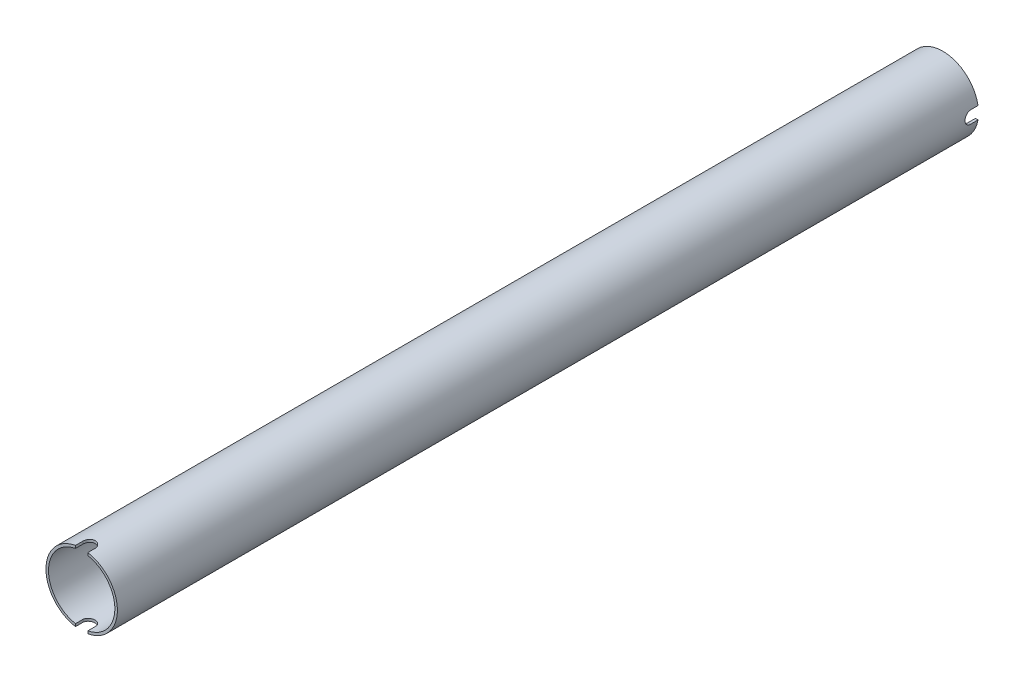
ISO-10303-21;
HEADER;
FILE_DESCRIPTION(('STEP AP214'),'2;1');
FILE_NAME('part.step','',(''),(''),'','','');
FILE_SCHEMA(('AUTOMOTIVE_DESIGN { 1 0 10303 214 1 1 1 1 }'));
ENDSEC;
DATA;
#1=APPLICATION_CONTEXT('core data for automotive mechanical design processes');
#2=APPLICATION_PROTOCOL_DEFINITION('international standard','automotive_design',2000,#1);
#3=PRODUCT_CONTEXT('',#1,'mechanical');
#4=PRODUCT('Part','Part','',(#3));
#5=PRODUCT_RELATED_PRODUCT_CATEGORY('part','',(#4));
#6=PRODUCT_DEFINITION_FORMATION('','',#4);
#7=PRODUCT_DEFINITION_CONTEXT('part definition',#1,'design');
#8=PRODUCT_DEFINITION('design','',#6,#7);
#9=PRODUCT_DEFINITION_SHAPE('','',#8);
#10=(LENGTH_UNIT() NAMED_UNIT(*) SI_UNIT(.MILLI.,.METRE.));
#11=(NAMED_UNIT(*) PLANE_ANGLE_UNIT() SI_UNIT($,.RADIAN.));
#12=(NAMED_UNIT(*) SI_UNIT($,.STERADIAN.) SOLID_ANGLE_UNIT());
#13=UNCERTAINTY_MEASURE_WITH_UNIT(LENGTH_MEASURE(1.E-05),#10,'distance_accuracy_value','');
#14=(GEOMETRIC_REPRESENTATION_CONTEXT(3) GLOBAL_UNCERTAINTY_ASSIGNED_CONTEXT((#13)) GLOBAL_UNIT_ASSIGNED_CONTEXT((#10,
#11,#12)) REPRESENTATION_CONTEXT('',''));
#15=CARTESIAN_POINT('',(0.,0.,0.));
#16=DIRECTION('',(0.,0.,1.));
#17=DIRECTION('',(1.,0.,0.));
#18=AXIS2_PLACEMENT_3D('',#15,#16,#17);
#19=CARTESIAN_POINT('',(0.,6.93419999999999,-90.01125));
#20=DIRECTION('',(0.,0.,1.));
#21=DIRECTION('',(1.,0.,0.));
#22=AXIS2_PLACEMENT_3D('',#19,#20,#21);
#23=PLANE('',#22);
#24=CARTESIAN_POINT('',(0.,0.,-90.01125));
#25=DIRECTION('',(0.,0.,1.));
#26=DIRECTION('',(1.,0.,0.));
#27=AXIS2_PLACEMENT_3D('',#24,#25,#26);
#28=CIRCLE('',#27,7.46760000000001);
#29=CARTESIAN_POINT('',(-7.35438567114888,-1.29540000000001,-90.01125));
#30=VERTEX_POINT('',#29);
#31=CARTESIAN_POINT('',(7.35438567114888,-1.29540000000001,-90.01125));
#32=VERTEX_POINT('',#31);
#33=EDGE_CURVE('E292',#30,#32,#28,.T.);
#34=ORIENTED_EDGE('',*,*,#33,.F.);
#35=DIRECTION('',(1.,0.,0.));
#36=VECTOR('',#35,1.);
#37=CARTESIAN_POINT('',(0.,-1.2954,-90.01125));
#38=LINE('',#37,#36);
#39=CARTESIAN_POINT('',(-6.8121265754535,-1.2954,-90.01125));
#40=VERTEX_POINT('',#39);
#41=EDGE_CURVE('E171',#30,#40,#38,.T.);
#42=ORIENTED_EDGE('',*,*,#41,.T.);
#43=CARTESIAN_POINT('',(0.,0.,-90.01125));
#44=DIRECTION('',(0.,0.,1.));
#45=DIRECTION('',(1.,0.,0.));
#46=AXIS2_PLACEMENT_3D('',#43,#44,#45);
#47=CIRCLE('',#46,6.93419999999999);
#48=CARTESIAN_POINT('',(6.8121265754535,-1.2954,-90.01125));
#49=VERTEX_POINT('',#48);
#50=EDGE_CURVE('E291',#40,#49,#47,.T.);
#51=ORIENTED_EDGE('',*,*,#50,.T.);
#52=EDGE_CURVE('E175',#49,#32,#38,.T.);
#53=ORIENTED_EDGE('',*,*,#52,.T.);
#54=EDGE_LOOP('',(#34,#42,#51,#53));
#55=FACE_BOUND('',#54,.T.);
#56=ADVANCED_FACE('F35',(#55),#23,.F.);
#57=CARTESIAN_POINT('',(0.,7.46759999999999,90.01125));
#58=DIRECTION('',(0.,0.,-1.));
#59=DIRECTION('',(-1.,0.,0.));
#60=AXIS2_PLACEMENT_3D('',#57,#58,#59);
#61=PLANE('',#60);
#62=CARTESIAN_POINT('',(0.,0.,90.01125));
#63=DIRECTION('',(0.,0.,1.));
#64=DIRECTION('',(1.,0.,0.));
#65=AXIS2_PLACEMENT_3D('',#62,#63,#64);
#66=CIRCLE('',#65,7.46759999999999);
#67=CARTESIAN_POINT('',(-1.2954,7.35438567114888,90.01125));
#68=VERTEX_POINT('',#67);
#69=CARTESIAN_POINT('',(-1.2954,-7.35438567114888,90.01125));
#70=VERTEX_POINT('',#69);
#71=EDGE_CURVE('E287',#68,#70,#66,.T.);
#72=ORIENTED_EDGE('',*,*,#71,.T.);
#73=DIRECTION('',(0.,1.,0.));
#74=VECTOR('',#73,1.);
#75=CARTESIAN_POINT('',(-1.2954,7.46759999999999,90.01125));
#76=LINE('',#75,#74);
#77=CARTESIAN_POINT('',(-1.2954,-6.8121265754535,90.01125));
#78=VERTEX_POINT('',#77);
#79=EDGE_CURVE('E278',#70,#78,#76,.T.);
#80=ORIENTED_EDGE('',*,*,#79,.T.);
#81=CARTESIAN_POINT('',(0.,0.,90.01125));
#82=DIRECTION('',(0.,0.,1.));
#83=DIRECTION('',(1.,0.,0.));
#84=AXIS2_PLACEMENT_3D('',#81,#82,#83);
#85=CIRCLE('',#84,6.93419999999999);
#86=CARTESIAN_POINT('',(-1.2954,6.8121265754535,90.01125));
#87=VERTEX_POINT('',#86);
#88=EDGE_CURVE('E297',#87,#78,#85,.T.);
#89=ORIENTED_EDGE('',*,*,#88,.F.);
#90=EDGE_CURVE('E274',#87,#68,#76,.T.);
#91=ORIENTED_EDGE('',*,*,#90,.T.);
#92=EDGE_LOOP('',(#72,#80,#89,#91));
#93=FACE_BOUND('',#92,.T.);
#94=ADVANCED_FACE('F308',(#93),#61,.F.);
#95=CARTESIAN_POINT('',(1.2954,-7.35438567114888,90.01125));
#96=VERTEX_POINT('',#95);
#97=CARTESIAN_POINT('',(1.2954,7.35438567114887,90.01125));
#98=VERTEX_POINT('',#97);
#99=EDGE_CURVE('E284',#96,#98,#66,.T.);
#100=ORIENTED_EDGE('',*,*,#99,.T.);
#101=DIRECTION('',(0.,-1.,0.));
#102=VECTOR('',#101,1.);
#103=CARTESIAN_POINT('',(1.2954,7.46759999999999,90.01125));
#104=LINE('',#103,#102);
#105=CARTESIAN_POINT('',(1.2954,6.8121265754535,90.01125));
#106=VERTEX_POINT('',#105);
#107=EDGE_CURVE('E325',#98,#106,#104,.T.);
#108=ORIENTED_EDGE('',*,*,#107,.T.);
#109=CARTESIAN_POINT('',(1.2954,-6.8121265754535,90.01125));
#110=VERTEX_POINT('',#109);
#111=EDGE_CURVE('E295',#110,#106,#85,.T.);
#112=ORIENTED_EDGE('',*,*,#111,.F.);
#113=EDGE_CURVE('E326',#110,#96,#104,.T.);
#114=ORIENTED_EDGE('',*,*,#113,.T.);
#115=EDGE_LOOP('',(#100,#108,#112,#114));
#116=FACE_BOUND('',#115,.T.);
#117=ADVANCED_FACE('F37',(#116),#61,.F.);
#118=CARTESIAN_POINT('',(0.,0.,54.4055316213805));
#119=DIRECTION('',(0.,0.,1.));
#120=DIRECTION('',(1.,0.,0.));
#121=AXIS2_PLACEMENT_3D('',#118,#119,#120);
#122=CYLINDRICAL_SURFACE('',#121,6.93419999999999);
#123=ORIENTED_EDGE('',*,*,#50,.F.);
#124=DIRECTION('',(0.,0.,1.));
#125=VECTOR('',#124,1.);
#126=CARTESIAN_POINT('',(-6.8121265754535,-1.29540000000001,54.4055316213805));
#127=LINE('',#126,#125);
#128=CARTESIAN_POINT('',(-6.8121265754535,-1.2954,-88.48725));
#129=VERTEX_POINT('',#128);
#130=EDGE_CURVE('E170',#40,#129,#127,.T.);
#131=ORIENTED_EDGE('',*,*,#130,.T.);
#132=CARTESIAN_POINT('',(-6.8121265754535,-1.2954,-88.48725));
#133=CARTESIAN_POINT('',(-6.81212486116484,-1.29540013699187,-88.4511445060641));
#134=CARTESIAN_POINT('',(-6.8124139893911,-1.29388954142777,-88.4150566280327));
#135=CARTESIAN_POINT('',(-6.81355602064963,-1.28786564610855,-88.3431454492232));
#136=CARTESIAN_POINT('',(-6.81440885952316,-1.28335268806711,-88.3073221188048));
#137=CARTESIAN_POINT('',(-6.81778099544098,-1.26536556579438,-88.2007445379712));
#138=CARTESIAN_POINT('',(-6.8211140744424,-1.24744295102498,-88.1307142203505));
#139=CARTESIAN_POINT('',(-6.82957011411668,-1.20027838562022,-87.994724591757));
#140=CARTESIAN_POINT('',(-6.83469335423679,-1.17103466766407,-87.9287659182675));
#141=CARTESIAN_POINT('',(-6.84614988720786,-1.10207922355403,-87.8026741969064));
#142=CARTESIAN_POINT('',(-6.85248325983094,-1.06236680723642,-87.7425415334803));
#143=CARTESIAN_POINT('',(-6.86573270424985,-0.973086320479177,-87.6290935799136));
#144=CARTESIAN_POINT('',(-6.87265439859156,-0.923415064372355,-87.575860175299));
#145=CARTESIAN_POINT('',(-6.88625165814546,-0.815844168823147,-87.4784257845944));
#146=CARTESIAN_POINT('',(-6.89292718528299,-0.757943263168412,-87.434226191001));
#147=CARTESIAN_POINT('',(-6.90534000409008,-0.635018062879804,-87.3558050695975));
#148=CARTESIAN_POINT('',(-6.91106983685105,-0.569943318979293,-87.3216613414624));
#149=CARTESIAN_POINT('',(-6.92088190288254,-0.434859961785096,-87.2648237910541));
#150=CARTESIAN_POINT('',(-6.92496436183804,-0.36485202586771,-87.2421284002883));
#151=CARTESIAN_POINT('',(-6.93098209625569,-0.222742255083513,-87.2090843952839));
#152=CARTESIAN_POINT('',(-6.93294156947332,-0.150673839911472,-87.1985965351363));
#153=CARTESIAN_POINT('',(-6.93457596989165,-0.00577377332465954,-87.1898313884485));
#154=CARTESIAN_POINT('',(-6.93425103676473,0.0670578311555857,-87.1915533553793));
#155=CARTESIAN_POINT('',(-6.93137206725993,0.210458344468027,-87.2070525853211));
#156=CARTESIAN_POINT('',(-6.92884581316386,0.281044130674403,-87.2206796034082));
#157=CARTESIAN_POINT('',(-6.92187923974746,0.418908774429751,-87.2593644297178));
#158=CARTESIAN_POINT('',(-6.91743886429478,0.486187534934476,-87.2844225731636));
#159=CARTESIAN_POINT('',(-6.90709643047967,0.615966096611637,-87.3454021445107));
#160=CARTESIAN_POINT('',(-6.90118629164061,0.678436891291547,-87.3813838780852));
#161=CARTESIAN_POINT('',(-6.88855832349516,0.796507857730594,-87.4631436743354));
#162=CARTESIAN_POINT('',(-6.88184044031279,0.852107570691326,-87.5089223906219));
#163=CARTESIAN_POINT('',(-6.86822108278513,0.955744038715096,-87.6097978887219));
#164=CARTESIAN_POINT('',(-6.86131836807592,1.00365385935701,-87.6650249838001));
#165=CARTESIAN_POINT('',(-6.84820244964764,1.08956316526959,-87.7828162044977));
#166=CARTESIAN_POINT('',(-6.84198943919024,1.12755987680003,-87.8453823765461));
#167=CARTESIAN_POINT('',(-6.83095363004522,1.19260098204662,-87.976252379713));
#168=CARTESIAN_POINT('',(-6.82613397134459,1.21962069318979,-88.0445687290047));
#169=CARTESIAN_POINT('',(-6.81847816267161,1.26172536242156,-88.1848363543268));
#170=CARTESIAN_POINT('',(-6.81563905550343,1.27682811836275,-88.25678203834));
#171=CARTESIAN_POINT('',(-6.81334722712931,1.2889666311106,-88.3556178942459));
#172=CARTESIAN_POINT('',(-6.81288994558935,1.2913800544401,-88.3819074607618));
#173=CARTESIAN_POINT('',(-6.81227989656846,1.29459468331232,-88.4345441157636));
#174=CARTESIAN_POINT('',(-6.8121266178893,1.29539859536211,-88.4608910329769));
#175=CARTESIAN_POINT('',(-6.8121265754535,1.2954,-88.48725));
#176=B_SPLINE_CURVE_WITH_KNOTS('',3,(#132,#133,#134,#135,#136,#137,#138,#139,#140,#141,#142,
#143,#144,#145,#146,#147,#148,#149,#150,#151,#152,#153,#154,#155,#156,#157,#158,#159,#160,#161,
#162,#163,#164,#165,#166,#167,#168,#169,#170,#171,#172,#173,#174,#175),.UNSPECIFIED.,.F.,.F.,(4,
2,2,2,2,2,2,2,2,2,2,2,2,2,2,2,2,2,2,2,2,4),(0.,0.108248930900297,0.216485543563386,
0.432459859435146,0.648467904344803,0.864490193452774,1.08287859669174,1.3013006375766,
1.52137065259745,1.7414105084796,1.95891507798372,2.1764063490148,2.39119183879021,
2.60598362766027,2.82198346918565,3.0379977257483,3.25727511731999,3.47661379821961,
3.6964429838779,3.91594323214535,3.99511664346655,4.07415680689762),.UNSPECIFIED.);
#177=CARTESIAN_POINT('',(-6.81212657545351,1.2954,-88.48725));
#178=VERTEX_POINT('',#177);
#179=EDGE_CURVE('E159',#129,#178,#176,.T.);
#180=ORIENTED_EDGE('',*,*,#179,.T.);
#181=DIRECTION('',(0.,0.,1.));
#182=VECTOR('',#181,1.);
#183=CARTESIAN_POINT('',(-6.81212657545351,1.29539999999996,54.4055316213805));
#184=LINE('',#183,#182);
#185=CARTESIAN_POINT('',(-6.8121265754535,1.2954,-90.01125));
#186=VERTEX_POINT('',#185);
#187=EDGE_CURVE('E146',#178,#186,#184,.F.);
#188=ORIENTED_EDGE('',*,*,#187,.T.);
#189=CARTESIAN_POINT('',(6.8121265754535,1.2954,-90.01125));
#190=VERTEX_POINT('',#189);
#191=EDGE_CURVE('E293',#190,#186,#47,.T.);
#192=ORIENTED_EDGE('',*,*,#191,.F.);
#193=DIRECTION('',(0.,0.,1.));
#194=VECTOR('',#193,1.);
#195=CARTESIAN_POINT('',(6.81212657545351,1.29539999999996,54.4055316213805));
#196=LINE('',#195,#194);
#197=CARTESIAN_POINT('',(6.8121265754535,1.2954,-88.48725));
#198=VERTEX_POINT('',#197);
#199=EDGE_CURVE('E356',#190,#198,#196,.T.);
#200=ORIENTED_EDGE('',*,*,#199,.T.);
#201=CARTESIAN_POINT('',(6.8121265754535,1.2954,-88.48725));
#202=CARTESIAN_POINT('',(6.81212486116484,1.29540013699187,-88.4511445060641));
#203=CARTESIAN_POINT('',(6.8124139893911,1.29388954142777,-88.4150566280327));
#204=CARTESIAN_POINT('',(6.81355602064963,1.28786564610855,-88.3431454492232));
#205=CARTESIAN_POINT('',(6.81440885952316,1.28335268806711,-88.3073221188048));
#206=CARTESIAN_POINT('',(6.81778099544098,1.26536556579438,-88.2007445379712));
#207=CARTESIAN_POINT('',(6.8211140744424,1.24744295102498,-88.1307142203505));
#208=CARTESIAN_POINT('',(6.82957011411668,1.20027838562022,-87.994724591757));
#209=CARTESIAN_POINT('',(6.83469335423679,1.17103466766407,-87.9287659182675));
#210=CARTESIAN_POINT('',(6.84614988720786,1.10207922355403,-87.8026741969064));
#211=CARTESIAN_POINT('',(6.85248325983094,1.06236680723642,-87.7425415334803));
#212=CARTESIAN_POINT('',(6.86573270424985,0.973086320479177,-87.6290935799136));
#213=CARTESIAN_POINT('',(6.87265439859156,0.923415064372355,-87.575860175299));
#214=CARTESIAN_POINT('',(6.88625165814546,0.815844168823148,-87.4784257845944));
#215=CARTESIAN_POINT('',(6.89292718528299,0.757943263168412,-87.434226191001));
#216=CARTESIAN_POINT('',(6.90534000409008,0.635018062879804,-87.3558050695975));
#217=CARTESIAN_POINT('',(6.91106983685105,0.569943318979293,-87.3216613414624));
#218=CARTESIAN_POINT('',(6.92088190288254,0.434859961785096,-87.2648237910541));
#219=CARTESIAN_POINT('',(6.92496436183804,0.36485202586771,-87.2421284002883));
#220=CARTESIAN_POINT('',(6.93098209625569,0.222742255083513,-87.2090843952839));
#221=CARTESIAN_POINT('',(6.93294156947332,0.150673839911473,-87.1985965351363));
#222=CARTESIAN_POINT('',(6.93457596989165,0.00577377332465965,-87.1898313884485));
#223=CARTESIAN_POINT('',(6.93425103676473,-0.0670578311555856,-87.1915533553793));
#224=CARTESIAN_POINT('',(6.93137206725993,-0.210458344468027,-87.2070525853211));
#225=CARTESIAN_POINT('',(6.92884581316386,-0.281044130674402,-87.2206796034082));
#226=CARTESIAN_POINT('',(6.92187923974746,-0.418908774429751,-87.2593644297178));
#227=CARTESIAN_POINT('',(6.91743886429478,-0.486187534934477,-87.2844225731636));
#228=CARTESIAN_POINT('',(6.90709643047967,-0.615966096611635,-87.3454021445107));
#229=CARTESIAN_POINT('',(6.90118629164062,-0.678436891291542,-87.3813838780852));
#230=CARTESIAN_POINT('',(6.88855832349516,-0.79650785773059,-87.4631436743354));
#231=CARTESIAN_POINT('',(6.88184044031279,-0.852107570691325,-87.5089223906219));
#232=CARTESIAN_POINT('',(6.86822108278513,-0.955744038715099,-87.6097978887219));
#233=CARTESIAN_POINT('',(6.86131836807592,-1.00365385935701,-87.6650249838001));
#234=CARTESIAN_POINT('',(6.84820244964764,-1.0895631652696,-87.7828162044977));
#235=CARTESIAN_POINT('',(6.84198943919024,-1.12755987680003,-87.8453823765461));
#236=CARTESIAN_POINT('',(6.83095363004522,-1.19260098204662,-87.976252379713));
#237=CARTESIAN_POINT('',(6.82613397134459,-1.21962069318979,-88.0445687290047));
#238=CARTESIAN_POINT('',(6.81847816267161,-1.26172536242156,-88.1848363543268));
#239=CARTESIAN_POINT('',(6.81563905550343,-1.27682811836275,-88.25678203834));
#240=CARTESIAN_POINT('',(6.81334722712931,-1.2889666311106,-88.3556178942459));
#241=CARTESIAN_POINT('',(6.81288994558935,-1.2913800544401,-88.3819074607618));
#242=CARTESIAN_POINT('',(6.81227989656846,-1.29459468331232,-88.4345441157636));
#243=CARTESIAN_POINT('',(6.8121266178893,-1.29539859536211,-88.4608910329769));
#244=CARTESIAN_POINT('',(6.8121265754535,-1.2954,-88.48725));
#245=B_SPLINE_CURVE_WITH_KNOTS('',3,(#201,#202,#203,#204,#205,#206,#207,#208,#209,#210,#211,
#212,#213,#214,#215,#216,#217,#218,#219,#220,#221,#222,#223,#224,#225,#226,#227,#228,#229,#230,
#231,#232,#233,#234,#235,#236,#237,#238,#239,#240,#241,#242,#243,#244),.UNSPECIFIED.,.F.,.F.,(4,
2,2,2,2,2,2,2,2,2,2,2,2,2,2,2,2,2,2,2,2,4),(0.,0.108248930900297,0.216485543563386,
0.432459859435146,0.648467904344803,0.864490193452774,1.08287859669174,1.3013006375766,
1.52137065259745,1.7414105084796,1.95891507798372,2.1764063490148,2.39119183879021,
2.60598362766027,2.82198346918564,3.0379977257483,3.25727511732001,3.4766137982196,
3.6964429838779,3.91594323214535,3.99511664346655,4.07415680689762),.UNSPECIFIED.);
#246=CARTESIAN_POINT('',(6.8121265754535,-1.2954,-88.48725));
#247=VERTEX_POINT('',#246);
#248=EDGE_CURVE('E154',#198,#247,#245,.T.);
#249=ORIENTED_EDGE('',*,*,#248,.T.);
#250=DIRECTION('',(0.,0.,1.));
#251=VECTOR('',#250,1.);
#252=CARTESIAN_POINT('',(6.8121265754535,-1.29540000000001,54.4055316213805));
#253=LINE('',#252,#251);
#254=EDGE_CURVE('E339',#247,#49,#253,.F.);
#255=ORIENTED_EDGE('',*,*,#254,.T.);
#256=EDGE_LOOP('',(#123,#131,#180,#188,#192,#200,#249,#255));
#257=FACE_BOUND('',#256,.T.);
#258=CARTESIAN_POINT('',(1.2954,6.8121265754535,88.48725));
#259=CARTESIAN_POINT('',(1.29540013699187,6.81212486116484,88.4511445060641));
#260=CARTESIAN_POINT('',(1.29388954142777,6.81241398939109,88.4150566280327));
#261=CARTESIAN_POINT('',(1.28786564610855,6.81355602064963,88.3431454492232));
#262=CARTESIAN_POINT('',(1.28335268806712,6.81440885952316,88.3073221188048));
#263=CARTESIAN_POINT('',(1.26536556579438,6.81778099544098,88.2007445379712));
#264=CARTESIAN_POINT('',(1.24744295102498,6.8211140744424,88.1307142203505));
#265=CARTESIAN_POINT('',(1.20027838562022,6.82957011411668,87.994724591757));
#266=CARTESIAN_POINT('',(1.17103466766407,6.83469335423679,87.9287659182675));
#267=CARTESIAN_POINT('',(1.10207922355403,6.84614988720786,87.8026741969064));
#268=CARTESIAN_POINT('',(1.06236680723642,6.85248325983094,87.7425415334803));
#269=CARTESIAN_POINT('',(0.973086320479178,6.86573270424985,87.6290935799136));
#270=CARTESIAN_POINT('',(0.923415064372356,6.87265439859156,87.575860175299));
#271=CARTESIAN_POINT('',(0.815844168823149,6.88625165814546,87.4784257845944));
#272=CARTESIAN_POINT('',(0.757943263168414,6.89292718528299,87.434226191001));
#273=CARTESIAN_POINT('',(0.635018062879806,6.90534000409008,87.3558050695975));
#274=CARTESIAN_POINT('',(0.569943318979295,6.91106983685105,87.3216613414624));
#275=CARTESIAN_POINT('',(0.434859961785098,6.92088190288254,87.2648237910541));
#276=CARTESIAN_POINT('',(0.364852025867711,6.92496436183804,87.2421284002883));
#277=CARTESIAN_POINT('',(0.222742255083513,6.93098209625569,87.2090843952839));
#278=CARTESIAN_POINT('',(0.150673839911473,6.93294156947332,87.1985965351364));
#279=CARTESIAN_POINT('',(0.00577377332465877,6.93457596989165,87.1898313884485));
#280=CARTESIAN_POINT('',(-0.0670578311555871,6.93425103676473,87.1915533553792));
#281=CARTESIAN_POINT('',(-0.210458344468027,6.93137206725993,87.2070525853211));
#282=CARTESIAN_POINT('',(-0.2810441306744,6.92884581316386,87.2206796034082));
#283=CARTESIAN_POINT('',(-0.418908774429748,6.92187923974746,87.2593644297178));
#284=CARTESIAN_POINT('',(-0.486187534934475,6.91743886429478,87.2844225731636));
#285=CARTESIAN_POINT('',(-0.61596609661164,6.90709643047967,87.3454021445107));
#286=CARTESIAN_POINT('',(-0.678436891291553,6.90118629164061,87.3813838780852));
#287=CARTESIAN_POINT('',(-0.7965078577306,6.88855832349516,87.4631436743354));
#288=CARTESIAN_POINT('',(-0.852107570691329,6.88184044031279,87.5089223906219));
#289=CARTESIAN_POINT('',(-0.955744038715099,6.86822108278513,87.6097978887219));
#290=CARTESIAN_POINT('',(-1.00365385935701,6.86131836807592,87.6650249838001));
#291=CARTESIAN_POINT('',(-1.0895631652696,6.84820244964764,87.7828162044977));
#292=CARTESIAN_POINT('',(-1.12755987680003,6.84198943919024,87.8453823765461));
#293=CARTESIAN_POINT('',(-1.19260098204662,6.83095363004522,87.976252379713));
#294=CARTESIAN_POINT('',(-1.21962069318979,6.82613397134459,88.0445687290047));
#295=CARTESIAN_POINT('',(-1.26172536242156,6.81847816267161,88.1848363543268));
#296=CARTESIAN_POINT('',(-1.27682811836275,6.81563905550343,88.25678203834));
#297=CARTESIAN_POINT('',(-1.2889666311106,6.81334722712931,88.3556178942459));
#298=CARTESIAN_POINT('',(-1.2913800544401,6.81288994558935,88.3819074607618));
#299=CARTESIAN_POINT('',(-1.29459468331232,6.81227989656846,88.4345441157636));
#300=CARTESIAN_POINT('',(-1.29539859536211,6.8121266178893,88.4608910329769));
#301=CARTESIAN_POINT('',(-1.2954,6.8121265754535,88.48725));
#302=B_SPLINE_CURVE_WITH_KNOTS('',3,(#258,#259,#260,#261,#262,#263,#264,#265,#266,#267,#268,
#269,#270,#271,#272,#273,#274,#275,#276,#277,#278,#279,#280,#281,#282,#283,#284,#285,#286,#287,
#288,#289,#290,#291,#292,#293,#294,#295,#296,#297,#298,#299,#300,#301),.UNSPECIFIED.,.F.,.F.,(4,
2,2,2,2,2,2,2,2,2,2,2,2,2,2,2,2,2,2,2,2,4),(0.,0.108248930900297,0.216485543563386,
0.432459859435146,0.648467904344803,0.864490193452774,1.08287859669174,1.3013006375766,
1.52137065259745,1.7414105084796,1.95891507798372,2.1764063490148,2.39119183879022,
2.60598362766028,2.82198346918566,3.03799772574831,3.25727511732001,3.47661379821961,
3.69644298387791,3.91594323214536,3.99511664346656,4.07415680689763),.UNSPECIFIED.);
#303=CARTESIAN_POINT('',(1.2954,6.81212657545349,88.48725));
#304=VERTEX_POINT('',#303);
#305=CARTESIAN_POINT('',(-1.2954,6.8121265754535,88.48725));
#306=VERTEX_POINT('',#305);
#307=EDGE_CURVE('E258',#304,#306,#302,.T.);
#308=ORIENTED_EDGE('',*,*,#307,.T.);
#309=DIRECTION('',(0.,0.,1.));
#310=VECTOR('',#309,1.);
#311=CARTESIAN_POINT('',(-1.2954,6.8121265754535,54.4055316213805));
#312=LINE('',#311,#310);
#313=EDGE_CURVE('E277',#306,#87,#312,.T.);
#314=ORIENTED_EDGE('',*,*,#313,.T.);
#315=ORIENTED_EDGE('',*,*,#88,.T.);
#316=DIRECTION('',(0.,0.,1.));
#317=VECTOR('',#316,1.);
#318=CARTESIAN_POINT('',(-1.2954,-6.8121265754535,54.4055316213805));
#319=LINE('',#318,#317);
#320=CARTESIAN_POINT('',(-1.2954,-6.8121265754535,88.48725));
#321=VERTEX_POINT('',#320);
#322=EDGE_CURVE('E281',#78,#321,#319,.F.);
#323=ORIENTED_EDGE('',*,*,#322,.T.);
#324=CARTESIAN_POINT('',(-1.2954,-6.8121265754535,88.48725));
#325=CARTESIAN_POINT('',(-1.29540013699187,-6.81212486116484,88.4511445060641));
#326=CARTESIAN_POINT('',(-1.29388954142777,-6.81241398939109,88.4150566280327));
#327=CARTESIAN_POINT('',(-1.28786564610855,-6.81355602064963,88.3431454492232));
#328=CARTESIAN_POINT('',(-1.28335268806712,-6.81440885952316,88.3073221188048));
#329=CARTESIAN_POINT('',(-1.26536556579438,-6.81778099544098,88.2007445379712));
#330=CARTESIAN_POINT('',(-1.24744295102498,-6.8211140744424,88.1307142203505));
#331=CARTESIAN_POINT('',(-1.20027838562022,-6.82957011411668,87.994724591757));
#332=CARTESIAN_POINT('',(-1.17103466766407,-6.83469335423679,87.9287659182675));
#333=CARTESIAN_POINT('',(-1.10207922355403,-6.84614988720786,87.8026741969064));
#334=CARTESIAN_POINT('',(-1.06236680723642,-6.85248325983094,87.7425415334803));
#335=CARTESIAN_POINT('',(-0.973086320479178,-6.86573270424985,87.6290935799136));
#336=CARTESIAN_POINT('',(-0.923415064372356,-6.87265439859156,87.575860175299));
#337=CARTESIAN_POINT('',(-0.815844168823149,-6.88625165814546,87.4784257845944));
#338=CARTESIAN_POINT('',(-0.757943263168414,-6.89292718528299,87.434226191001));
#339=CARTESIAN_POINT('',(-0.635018062879806,-6.90534000409008,87.3558050695975));
#340=CARTESIAN_POINT('',(-0.569943318979295,-6.91106983685105,87.3216613414624));
#341=CARTESIAN_POINT('',(-0.434859961785098,-6.92088190288254,87.2648237910541));
#342=CARTESIAN_POINT('',(-0.364852025867712,-6.92496436183804,87.2421284002883));
#343=CARTESIAN_POINT('',(-0.222742255083514,-6.93098209625569,87.2090843952839));
#344=CARTESIAN_POINT('',(-0.150673839911473,-6.93294156947332,87.1985965351364));
#345=CARTESIAN_POINT('',(-0.00577377332465936,-6.93457596989165,87.1898313884485));
#346=CARTESIAN_POINT('',(0.0670578311555865,-6.93425103676473,87.1915533553792));
#347=CARTESIAN_POINT('',(0.210458344468026,-6.93137206725993,87.2070525853211));
#348=CARTESIAN_POINT('',(0.281044130674399,-6.92884581316386,87.2206796034082));
#349=CARTESIAN_POINT('',(0.418908774429747,-6.92187923974746,87.2593644297178));
#350=CARTESIAN_POINT('',(0.486187534934475,-6.91743886429478,87.2844225731636));
#351=CARTESIAN_POINT('',(0.615966096611637,-6.90709643047967,87.3454021445107));
#352=CARTESIAN_POINT('',(0.678436891291546,-6.90118629164061,87.3813838780852));
#353=CARTESIAN_POINT('',(0.796507857730591,-6.88855832349516,87.4631436743354));
#354=CARTESIAN_POINT('',(0.852107570691322,-6.88184044031279,87.5089223906219));
#355=CARTESIAN_POINT('',(0.955744038715095,-6.86822108278513,87.6097978887219));
#356=CARTESIAN_POINT('',(1.00365385935701,-6.86131836807592,87.6650249838001));
#357=CARTESIAN_POINT('',(1.0895631652696,-6.84820244964764,87.7828162044977));
#358=CARTESIAN_POINT('',(1.12755987680003,-6.84198943919024,87.8453823765461));
#359=CARTESIAN_POINT('',(1.19260098204663,-6.83095363004522,87.976252379713));
#360=CARTESIAN_POINT('',(1.21962069318979,-6.82613397134459,88.0445687290047));
#361=CARTESIAN_POINT('',(1.26172536242156,-6.81847816267161,88.1848363543268));
#362=CARTESIAN_POINT('',(1.27682811836276,-6.81563905550343,88.25678203834));
#363=CARTESIAN_POINT('',(1.2889666311106,-6.81334722712931,88.3556178942459));
#364=CARTESIAN_POINT('',(1.2913800544401,-6.81288994558935,88.3819074607618));
#365=CARTESIAN_POINT('',(1.29459468331232,-6.81227989656846,88.4345441157636));
#366=CARTESIAN_POINT('',(1.29539859536211,-6.8121266178893,88.4608910329769));
#367=CARTESIAN_POINT('',(1.2954,-6.8121265754535,88.48725));
#368=B_SPLINE_CURVE_WITH_KNOTS('',3,(#324,#325,#326,#327,#328,#329,#330,#331,#332,#333,#334,
#335,#336,#337,#338,#339,#340,#341,#342,#343,#344,#345,#346,#347,#348,#349,#350,#351,#352,#353,
#354,#355,#356,#357,#358,#359,#360,#361,#362,#363,#364,#365,#366,#367),.UNSPECIFIED.,.F.,.F.,(4,
2,2,2,2,2,2,2,2,2,2,2,2,2,2,2,2,2,2,2,2,4),(0.,0.108248930900297,0.216485543563386,
0.432459859435146,0.648467904344803,0.864490193452774,1.08287859669174,1.3013006375766,
1.52137065259745,1.7414105084796,1.95891507798372,2.1764063490148,2.39119183879022,
2.60598362766028,2.82198346918565,3.03799772574831,3.25727511732001,3.4766137982196,
3.69644298387791,3.91594323214537,3.99511664346656,4.07415680689763),.UNSPECIFIED.);
#369=CARTESIAN_POINT('',(1.2954,-6.8121265754535,88.48725));
#370=VERTEX_POINT('',#369);
#371=EDGE_CURVE('E265',#321,#370,#368,.T.);
#372=ORIENTED_EDGE('',*,*,#371,.T.);
#373=DIRECTION('',(0.,0.,1.));
#374=VECTOR('',#373,1.);
#375=CARTESIAN_POINT('',(1.2954,-6.8121265754535,54.4055316213805));
#376=LINE('',#375,#374);
#377=EDGE_CURVE('E329',#370,#110,#376,.T.);
#378=ORIENTED_EDGE('',*,*,#377,.T.);
#379=ORIENTED_EDGE('',*,*,#111,.T.);
#380=DIRECTION('',(0.,0.,1.));
#381=VECTOR('',#380,1.);
#382=CARTESIAN_POINT('',(1.2954,6.8121265754535,54.4055316213805));
#383=LINE('',#382,#381);
#384=EDGE_CURVE('E266',#106,#304,#383,.F.);
#385=ORIENTED_EDGE('',*,*,#384,.T.);
#386=EDGE_LOOP('',(#308,#314,#315,#323,#372,#378,#379,#385));
#387=FACE_BOUND('',#386,.T.);
#388=ADVANCED_FACE('F168',(#257,#387),#122,.F.);
#389=CARTESIAN_POINT('',(7.3543856711489,1.29539999999996,-90.01125));
#390=VERTEX_POINT('',#389);
#391=CARTESIAN_POINT('',(-7.35438567114889,1.29539999999996,-90.01125));
#392=VERTEX_POINT('',#391);
#393=EDGE_CURVE('E288',#390,#392,#28,.T.);
#394=ORIENTED_EDGE('',*,*,#393,.F.);
#395=DIRECTION('',(-1.,0.,0.));
#396=VECTOR('',#395,1.);
#397=CARTESIAN_POINT('',(0.,1.2954,-90.01125));
#398=LINE('',#397,#396);
#399=EDGE_CURVE('E58',#390,#190,#398,.T.);
#400=ORIENTED_EDGE('',*,*,#399,.T.);
#401=ORIENTED_EDGE('',*,*,#191,.T.);
#402=EDGE_CURVE('E149',#186,#392,#398,.T.);
#403=ORIENTED_EDGE('',*,*,#402,.T.);
#404=EDGE_LOOP('',(#394,#400,#401,#403));
#405=FACE_BOUND('',#404,.T.);
#406=ADVANCED_FACE('F221',(#405),#23,.F.);
#407=CARTESIAN_POINT('',(0.,0.,54.4055316213805));
#408=DIRECTION('',(0.,0.,1.));
#409=DIRECTION('',(1.,0.,0.));
#410=AXIS2_PLACEMENT_3D('',#407,#408,#409);
#411=CYLINDRICAL_SURFACE('',#410,7.4676);
#412=ORIENTED_EDGE('',*,*,#71,.F.);
#413=DIRECTION('',(0.,0.,1.));
#414=VECTOR('',#413,1.);
#415=CARTESIAN_POINT('',(-1.2954,7.35438567114888,54.4055316213805));
#416=LINE('',#415,#414);
#417=CARTESIAN_POINT('',(-1.2954,7.35438567114888,88.48725));
#418=VERTEX_POINT('',#417);
#419=EDGE_CURVE('E245',#68,#418,#416,.F.);
#420=ORIENTED_EDGE('',*,*,#419,.T.);
#421=CARTESIAN_POINT('',(-1.2954,7.35438567114888,88.48725));
#422=CARTESIAN_POINT('',(-1.29540008475993,7.35438409297162,88.451097555183));
#423=CARTESIAN_POINT('',(-1.29388561170881,7.35465258617188,88.4149627034642));
#424=CARTESIAN_POINT('',(-1.28784590497766,7.35571319509208,88.3429570215491));
#425=CARTESIAN_POINT('',(-1.28332098602105,7.35650525607621,88.3070861641501));
#426=CARTESIAN_POINT('',(-1.26528419386673,7.3596374856876,88.2003587053799));
#427=CARTESIAN_POINT('',(-1.24731009594914,7.36273384454404,88.1302256315515));
#428=CARTESIAN_POINT('',(-1.20000104530186,7.37059121176742,87.994031567069));
#429=CARTESIAN_POINT('',(-1.17066383111166,7.37535255147657,87.9279713900286));
#430=CARTESIAN_POINT('',(-1.10148019254623,7.38600106448598,87.8016968239007));
#431=CARTESIAN_POINT('',(-1.06163345037138,7.3918882718301,87.7414826116657));
#432=CARTESIAN_POINT('',(-0.972116191117354,7.40419436861752,87.6279916827014));
#433=CARTESIAN_POINT('',(-0.922356493027542,7.41061775229925,87.5747858177959));
#434=CARTESIAN_POINT('',(-0.814612655507203,7.42323330585025,87.4774283509333));
#435=CARTESIAN_POINT('',(-0.756627255481142,7.42942544009629,87.4332781393038));
#436=CARTESIAN_POINT('',(-0.633616346360539,7.44092835020957,87.3550225147222));
#437=CARTESIAN_POINT('',(-0.568547737541024,7.44623316791288,87.3209839018787));
#438=CARTESIAN_POINT('',(-0.433512377066529,7.45531287838287,87.2643488442433));
#439=CARTESIAN_POINT('',(-0.363546247495494,7.45908796504419,87.2417509492405));
#440=CARTESIAN_POINT('',(-0.221438545193984,7.4646512575481,87.2088556365631));
#441=CARTESIAN_POINT('',(-0.149325603846323,7.46645889066247,87.1984378708078));
#442=CARTESIAN_POINT('',(-0.00435250195423793,7.46795044081142,87.1898239963306));
#443=CARTESIAN_POINT('',(0.0685076212344787,7.46763446350502,87.1916272795575));
#444=CARTESIAN_POINT('',(0.212079490589399,7.46492963153798,87.2073114023439));
#445=CARTESIAN_POINT('',(0.282805903143311,7.46256306554843,87.2210623819952));
#446=CARTESIAN_POINT('',(0.420931538364068,7.45604788366907,87.2600467033166));
#447=CARTESIAN_POINT('',(0.488330674955484,7.451899221704,87.2852803418668));
#448=CARTESIAN_POINT('',(0.618273340743678,7.44224817721291,87.3466415224205));
#449=CARTESIAN_POINT('',(0.680791241419501,7.43673920925363,87.3828222588068));
#450=CARTESIAN_POINT('',(0.798914930101399,7.42497901877505,87.4650103280708));
#451=CARTESIAN_POINT('',(0.854520363506323,7.41872775820919,87.511018164738));
#452=CARTESIAN_POINT('',(0.958004488752812,7.40608095198628,87.6122662410361));
#453=CARTESIAN_POINT('',(1.00577316861571,7.3996845874204,87.6676188728794));
#454=CARTESIAN_POINT('',(1.09137675549654,7.38754508008618,87.785629394064));
#455=CARTESIAN_POINT('',(1.12920884869495,7.38180212260856,87.8482893454371));
#456=CARTESIAN_POINT('',(1.1938904287351,7.37161811838356,87.9792780418799));
#457=CARTESIAN_POINT('',(1.22071941115377,7.36717950662153,88.047617087684));
#458=CARTESIAN_POINT('',(1.26244780526102,7.36014474428322,88.1878800317516));
#459=CARTESIAN_POINT('',(1.27736503543515,7.35754584239559,88.2597984039326));
#460=CARTESIAN_POINT('',(1.28920746874031,7.3554740774538,88.3580993018426));
#461=CARTESIAN_POINT('',(1.29153060787886,7.35506630502512,88.3838958759453));
#462=CARTESIAN_POINT('',(1.29462486554018,7.35452236758449,88.435541183308));
#463=CARTESIAN_POINT('',(1.29539859348484,7.35438574592076,88.4613897553597));
#464=CARTESIAN_POINT('',(1.2954,7.35438567114888,88.48725));
#465=B_SPLINE_CURVE_WITH_KNOTS('',3,(#421,#422,#423,#424,#425,#426,#427,#428,#429,#430,#431,
#432,#433,#434,#435,#436,#437,#438,#439,#440,#441,#442,#443,#444,#445,#446,#447,#448,#449,#450,
#451,#452,#453,#454,#455,#456,#457,#458,#459,#460,#461,#462,#463,#464),.UNSPECIFIED.,.F.,.F.,(4,
2,2,2,2,2,2,2,2,2,2,2,2,2,2,2,2,2,2,2,2,4),(0.,0.108389841827377,0.216768353950311,
0.433046864831288,0.649368441084375,0.865696559476644,1.08406670709274,1.30247035633794,
1.52228629733927,1.74207436777052,1.95967191951153,2.17725864488931,2.39250958520376,
2.60776609106752,2.82408584862906,3.0404166985554,3.25956378822574,3.47877286871434,
3.69838861174844,3.9176752185489,3.99535165332775,4.07289715989852),.UNSPECIFIED.);
#466=CARTESIAN_POINT('',(1.2954,7.35438567114888,88.48725));
#467=VERTEX_POINT('',#466);
#468=EDGE_CURVE('E237',#418,#467,#465,.T.);
#469=ORIENTED_EDGE('',*,*,#468,.T.);
#470=DIRECTION('',(0.,0.,1.));
#471=VECTOR('',#470,1.);
#472=CARTESIAN_POINT('',(1.2954,7.35438567114888,54.4055316213805));
#473=LINE('',#472,#471);
#474=EDGE_CURVE('E246',#467,#98,#473,.T.);
#475=ORIENTED_EDGE('',*,*,#474,.T.);
#476=ORIENTED_EDGE('',*,*,#99,.F.);
#477=DIRECTION('',(0.,0.,1.));
#478=VECTOR('',#477,1.);
#479=CARTESIAN_POINT('',(1.2954,-7.35438567114888,54.4055316213805));
#480=LINE('',#479,#478);
#481=CARTESIAN_POINT('',(1.2954,-7.35438567114888,88.48725));
#482=VERTEX_POINT('',#481);
#483=EDGE_CURVE('E298',#96,#482,#480,.F.);
#484=ORIENTED_EDGE('',*,*,#483,.T.);
#485=CARTESIAN_POINT('',(1.2954,-7.35438567114888,88.48725));
#486=CARTESIAN_POINT('',(1.29540008475993,-7.35438409297162,88.451097555183));
#487=CARTESIAN_POINT('',(1.29388561170881,-7.35465258617188,88.4149627034642));
#488=CARTESIAN_POINT('',(1.28784590497766,-7.35571319509208,88.3429570215491));
#489=CARTESIAN_POINT('',(1.28332098602105,-7.35650525607621,88.3070861641501));
#490=CARTESIAN_POINT('',(1.26528419386673,-7.3596374856876,88.2003587053799));
#491=CARTESIAN_POINT('',(1.24731009594914,-7.36273384454404,88.1302256315515));
#492=CARTESIAN_POINT('',(1.20000104530186,-7.37059121176742,87.994031567069));
#493=CARTESIAN_POINT('',(1.17066383111166,-7.37535255147657,87.9279713900286));
#494=CARTESIAN_POINT('',(1.10148019254623,-7.38600106448598,87.8016968239007));
#495=CARTESIAN_POINT('',(1.06163345037138,-7.3918882718301,87.7414826116657));
#496=CARTESIAN_POINT('',(0.972116191117354,-7.40419436861752,87.6279916827014));
#497=CARTESIAN_POINT('',(0.922356493027542,-7.41061775229925,87.5747858177959));
#498=CARTESIAN_POINT('',(0.814612655507203,-7.42323330585025,87.4774283509333));
#499=CARTESIAN_POINT('',(0.756627255481142,-7.42942544009629,87.4332781393038));
#500=CARTESIAN_POINT('',(0.63361634636054,-7.44092835020957,87.3550225147222));
#501=CARTESIAN_POINT('',(0.568547737541024,-7.44623316791288,87.3209839018787));
#502=CARTESIAN_POINT('',(0.433512377066529,-7.45531287838287,87.2643488442433));
#503=CARTESIAN_POINT('',(0.363546247495494,-7.45908796504419,87.2417509492405));
#504=CARTESIAN_POINT('',(0.221438545193984,-7.4646512575481,87.2088556365631));
#505=CARTESIAN_POINT('',(0.149325603846323,-7.46645889066247,87.1984378708078));
#506=CARTESIAN_POINT('',(0.00435250195423773,-7.46795044081142,87.1898239963306));
#507=CARTESIAN_POINT('',(-0.0685076212344789,-7.46763446350502,87.1916272795575));
#508=CARTESIAN_POINT('',(-0.212079490589398,-7.46492963153798,87.2073114023439));
#509=CARTESIAN_POINT('',(-0.282805903143309,-7.46256306554843,87.2210623819952));
#510=CARTESIAN_POINT('',(-0.420931538364067,-7.45604788366907,87.2600467033166));
#511=CARTESIAN_POINT('',(-0.488330674955484,-7.451899221704,87.2852803418668));
#512=CARTESIAN_POINT('',(-0.618273340743674,-7.44224817721291,87.3466415224205));
#513=CARTESIAN_POINT('',(-0.680791241419491,-7.43673920925363,87.3828222588068));
#514=CARTESIAN_POINT('',(-0.798914930101387,-7.42497901877505,87.4650103280708));
#515=CARTESIAN_POINT('',(-0.854520363506317,-7.41872775820919,87.511018164738));
#516=CARTESIAN_POINT('',(-0.958004488752811,-7.40608095198628,87.612266241036));
#517=CARTESIAN_POINT('',(-1.00577316861571,-7.39968458742039,87.6676188728794));
#518=CARTESIAN_POINT('',(-1.09137675549653,-7.38754508008618,87.785629394064));
#519=CARTESIAN_POINT('',(-1.12920884869495,-7.38180212260856,87.8482893454371));
#520=CARTESIAN_POINT('',(-1.1938904287351,-7.37161811838356,87.9792780418799));
#521=CARTESIAN_POINT('',(-1.22071941115378,-7.36717950662153,88.047617087684));
#522=CARTESIAN_POINT('',(-1.26244780526102,-7.36014474428322,88.1878800317516));
#523=CARTESIAN_POINT('',(-1.27736503543515,-7.35754584239559,88.2597984039326));
#524=CARTESIAN_POINT('',(-1.2892074687403,-7.3554740774538,88.3580993018426));
#525=CARTESIAN_POINT('',(-1.29153060787886,-7.35506630502512,88.3838958759453));
#526=CARTESIAN_POINT('',(-1.29462486554018,-7.35452236758449,88.435541183308));
#527=CARTESIAN_POINT('',(-1.29539859348484,-7.35438574592076,88.4613897553597));
#528=CARTESIAN_POINT('',(-1.2954,-7.35438567114888,88.48725));
#529=B_SPLINE_CURVE_WITH_KNOTS('',3,(#485,#486,#487,#488,#489,#490,#491,#492,#493,#494,#495,
#496,#497,#498,#499,#500,#501,#502,#503,#504,#505,#506,#507,#508,#509,#510,#511,#512,#513,#514,
#515,#516,#517,#518,#519,#520,#521,#522,#523,#524,#525,#526,#527,#528),.UNSPECIFIED.,.F.,.F.,(4,
2,2,2,2,2,2,2,2,2,2,2,2,2,2,2,2,2,2,2,2,4),(0.,0.108389841827377,0.216768353950311,
0.433046864831288,0.649368441084375,0.865696559476644,1.08406670709274,1.30247035633794,
1.52228629733927,1.74207436777052,1.95967191951153,2.17725864488931,2.39250958520376,
2.60776609106752,2.82408584862906,3.04041669855538,3.25956378822574,3.47877286871434,
3.69838861174844,3.91767521854889,3.99535165332775,4.07289715989852),.UNSPECIFIED.);
#530=CARTESIAN_POINT('',(-1.2954,-7.35438567114888,88.48725));
#531=VERTEX_POINT('',#530);
#532=EDGE_CURVE('E228',#482,#531,#529,.T.);
#533=ORIENTED_EDGE('',*,*,#532,.T.);
#534=DIRECTION('',(0.,0.,1.));
#535=VECTOR('',#534,1.);
#536=CARTESIAN_POINT('',(-1.2954,-7.35438567114888,54.4055316213805));
#537=LINE('',#536,#535);
#538=EDGE_CURVE('E302',#531,#70,#537,.T.);
#539=ORIENTED_EDGE('',*,*,#538,.T.);
#540=EDGE_LOOP('',(#412,#420,#469,#475,#476,#484,#533,#539));
#541=FACE_BOUND('',#540,.T.);
#542=CARTESIAN_POINT('',(-7.35438567114888,1.2954,-88.48725));
#543=CARTESIAN_POINT('',(-7.35438409297162,1.29540008475993,-88.451097555183));
#544=CARTESIAN_POINT('',(-7.35465258617188,1.29388561170881,-88.4149627034642));
#545=CARTESIAN_POINT('',(-7.35571319509208,1.28784590497766,-88.3429570215491));
#546=CARTESIAN_POINT('',(-7.35650525607621,1.28332098602105,-88.3070861641501));
#547=CARTESIAN_POINT('',(-7.3596374856876,1.26528419386673,-88.2003587053799));
#548=CARTESIAN_POINT('',(-7.36273384454404,1.24731009594914,-88.1302256315515));
#549=CARTESIAN_POINT('',(-7.37059121176742,1.20000104530186,-87.994031567069));
#550=CARTESIAN_POINT('',(-7.37535255147657,1.17066383111166,-87.9279713900286));
#551=CARTESIAN_POINT('',(-7.38600106448598,1.10148019254622,-87.8016968239007));
#552=CARTESIAN_POINT('',(-7.3918882718301,1.06163345037138,-87.7414826116657));
#553=CARTESIAN_POINT('',(-7.40419436861752,0.972116191117351,-87.6279916827014));
#554=CARTESIAN_POINT('',(-7.41061775229925,0.922356493027535,-87.5747858177959));
#555=CARTESIAN_POINT('',(-7.42323330585026,0.814612655507196,-87.4774283509333));
#556=CARTESIAN_POINT('',(-7.42942544009629,0.756627255481138,-87.4332781393038));
#557=CARTESIAN_POINT('',(-7.44092835020957,0.633616346360539,-87.3550225147222));
#558=CARTESIAN_POINT('',(-7.44623316791288,0.568547737541022,-87.3209839018787));
#559=CARTESIAN_POINT('',(-7.45531287838287,0.433512377066527,-87.2643488442433));
#560=CARTESIAN_POINT('',(-7.45908796504419,0.363546247495492,-87.2417509492405));
#561=CARTESIAN_POINT('',(-7.4646512575481,0.221438545193983,-87.2088556365631));
#562=CARTESIAN_POINT('',(-7.46645889066247,0.149325603846322,-87.1984378708078));
#563=CARTESIAN_POINT('',(-7.46795044081142,0.00435250195423732,-87.1898239963306));
#564=CARTESIAN_POINT('',(-7.46763446350502,-0.0685076212344794,-87.1916272795575));
#565=CARTESIAN_POINT('',(-7.46492963153798,-0.212079490589399,-87.2073114023439));
#566=CARTESIAN_POINT('',(-7.46256306554843,-0.282805903143311,-87.2210623819952));
#567=CARTESIAN_POINT('',(-7.45604788366907,-0.420931538364068,-87.2600467033166));
#568=CARTESIAN_POINT('',(-7.451899221704,-0.488330674955483,-87.2852803418668));
#569=CARTESIAN_POINT('',(-7.44224817721291,-0.618273340743677,-87.3466415224205));
#570=CARTESIAN_POINT('',(-7.43673920925363,-0.6807912414195,-87.3828222588068));
#571=CARTESIAN_POINT('',(-7.42497901877505,-0.798914930101398,-87.4650103280708));
#572=CARTESIAN_POINT('',(-7.41872775820919,-0.854520363506322,-87.511018164738));
#573=CARTESIAN_POINT('',(-7.40608095198628,-0.958004488752811,-87.6122662410361));
#574=CARTESIAN_POINT('',(-7.3996845874204,-1.00577316861571,-87.6676188728794));
#575=CARTESIAN_POINT('',(-7.38754508008618,-1.09137675549654,-87.785629394064));
#576=CARTESIAN_POINT('',(-7.38180212260856,-1.12920884869495,-87.8482893454371));
#577=CARTESIAN_POINT('',(-7.37161811838356,-1.1938904287351,-87.9792780418799));
#578=CARTESIAN_POINT('',(-7.36717950662153,-1.22071941115377,-88.047617087684));
#579=CARTESIAN_POINT('',(-7.36014474428322,-1.26244780526102,-88.1878800317516));
#580=CARTESIAN_POINT('',(-7.35754584239559,-1.27736503543515,-88.2597984039326));
#581=CARTESIAN_POINT('',(-7.3554740774538,-1.2892074687403,-88.3580993018426));
#582=CARTESIAN_POINT('',(-7.35506630502512,-1.29153060787886,-88.3838958759453));
#583=CARTESIAN_POINT('',(-7.35452236758449,-1.29462486554018,-88.435541183308));
#584=CARTESIAN_POINT('',(-7.35438574592076,-1.29539859348484,-88.4613897553597));
#585=CARTESIAN_POINT('',(-7.35438567114888,-1.2954,-88.48725));
#586=B_SPLINE_CURVE_WITH_KNOTS('',3,(#542,#543,#544,#545,#546,#547,#548,#549,#550,#551,#552,
#553,#554,#555,#556,#557,#558,#559,#560,#561,#562,#563,#564,#565,#566,#567,#568,#569,#570,#571,
#572,#573,#574,#575,#576,#577,#578,#579,#580,#581,#582,#583,#584,#585),.UNSPECIFIED.,.F.,.F.,(4,
2,2,2,2,2,2,2,2,2,2,2,2,2,2,2,2,2,2,2,2,4),(0.,0.108389841827377,0.216768353950311,
0.433046864831288,0.649368441084375,0.865696559476644,1.08406670709275,1.30247035633794,
1.52228629733927,1.74207436777052,1.95967191951153,2.17725864488931,2.39250958520376,
2.60776609106752,2.82408584862906,3.0404166985554,3.25956378822573,3.47877286871434,
3.69838861174843,3.9176752185489,3.99535165332775,4.07289715989853),.UNSPECIFIED.);
#587=CARTESIAN_POINT('',(-7.35438567114889,1.29539999999996,-88.48725));
#588=VERTEX_POINT('',#587);
#589=CARTESIAN_POINT('',(-7.35438567114888,-1.2954,-88.48725));
#590=VERTEX_POINT('',#589);
#591=EDGE_CURVE('E43',#588,#590,#586,.T.);
#592=ORIENTED_EDGE('',*,*,#591,.T.);
#593=DIRECTION('',(0.,0.,1.));
#594=VECTOR('',#593,1.);
#595=CARTESIAN_POINT('',(-7.35438567114888,-1.29540000000001,54.4055316213805));
#596=LINE('',#595,#594);
#597=EDGE_CURVE('E11',#590,#30,#596,.F.);
#598=ORIENTED_EDGE('',*,*,#597,.T.);
#599=ORIENTED_EDGE('',*,*,#33,.T.);
#600=DIRECTION('',(0.,0.,1.));
#601=VECTOR('',#600,1.);
#602=CARTESIAN_POINT('',(7.35438567114888,-1.29540000000001,54.4055316213805));
#603=LINE('',#602,#601);
#604=CARTESIAN_POINT('',(7.35438567114888,-1.2954,-88.48725));
#605=VERTEX_POINT('',#604);
#606=EDGE_CURVE('E352',#32,#605,#603,.T.);
#607=ORIENTED_EDGE('',*,*,#606,.T.);
#608=CARTESIAN_POINT('',(7.35438567114888,-1.2954,-88.48725));
#609=CARTESIAN_POINT('',(7.35438409297162,-1.29540008475993,-88.451097555183));
#610=CARTESIAN_POINT('',(7.35465258617188,-1.29388561170881,-88.4149627034642));
#611=CARTESIAN_POINT('',(7.35571319509208,-1.28784590497766,-88.3429570215491));
#612=CARTESIAN_POINT('',(7.35650525607621,-1.28332098602105,-88.3070861641501));
#613=CARTESIAN_POINT('',(7.3596374856876,-1.26528419386673,-88.2003587053799));
#614=CARTESIAN_POINT('',(7.36273384454404,-1.24731009594914,-88.1302256315515));
#615=CARTESIAN_POINT('',(7.37059121176742,-1.20000104530186,-87.994031567069));
#616=CARTESIAN_POINT('',(7.37535255147657,-1.17066383111166,-87.9279713900286));
#617=CARTESIAN_POINT('',(7.38600106448598,-1.10148019254622,-87.8016968239007));
#618=CARTESIAN_POINT('',(7.3918882718301,-1.06163345037138,-87.7414826116657));
#619=CARTESIAN_POINT('',(7.40419436861752,-0.972116191117351,-87.6279916827014));
#620=CARTESIAN_POINT('',(7.41061775229925,-0.922356493027535,-87.5747858177959));
#621=CARTESIAN_POINT('',(7.42323330585026,-0.814612655507196,-87.4774283509333));
#622=CARTESIAN_POINT('',(7.42942544009629,-0.756627255481138,-87.4332781393038));
#623=CARTESIAN_POINT('',(7.44092835020957,-0.63361634636054,-87.3550225147222));
#624=CARTESIAN_POINT('',(7.44623316791288,-0.568547737541026,-87.3209839018787));
#625=CARTESIAN_POINT('',(7.45531287838287,-0.433512377066531,-87.2643488442433));
#626=CARTESIAN_POINT('',(7.45908796504419,-0.363546247495494,-87.2417509492405));
#627=CARTESIAN_POINT('',(7.4646512575481,-0.221438545193983,-87.2088556365631));
#628=CARTESIAN_POINT('',(7.46645889066247,-0.149325603846323,-87.1984378708078));
#629=CARTESIAN_POINT('',(7.46795044081142,-0.004352501954238,-87.1898239963306));
#630=CARTESIAN_POINT('',(7.46763446350502,0.0685076212344788,-87.1916272795575));
#631=CARTESIAN_POINT('',(7.46492963153798,0.212079490589399,-87.2073114023439));
#632=CARTESIAN_POINT('',(7.46256306554843,0.28280590314331,-87.2210623819952));
#633=CARTESIAN_POINT('',(7.45604788366907,0.420931538364067,-87.2600467033166));
#634=CARTESIAN_POINT('',(7.451899221704,0.488330674955483,-87.2852803418668));
#635=CARTESIAN_POINT('',(7.44224817721291,0.618273340743677,-87.3466415224205));
#636=CARTESIAN_POINT('',(7.43673920925363,0.680791241419501,-87.3828222588068));
#637=CARTESIAN_POINT('',(7.42497901877505,0.798914930101398,-87.4650103280708));
#638=CARTESIAN_POINT('',(7.41872775820919,0.854520363506322,-87.511018164738));
#639=CARTESIAN_POINT('',(7.40608095198628,0.958004488752811,-87.6122662410361));
#640=CARTESIAN_POINT('',(7.3996845874204,1.00577316861571,-87.6676188728794));
#641=CARTESIAN_POINT('',(7.38754508008618,1.09137675549654,-87.785629394064));
#642=CARTESIAN_POINT('',(7.38180212260856,1.12920884869495,-87.8482893454371));
#643=CARTESIAN_POINT('',(7.37161811838356,1.1938904287351,-87.9792780418799));
#644=CARTESIAN_POINT('',(7.36717950662153,1.22071941115378,-88.0476170876841));
#645=CARTESIAN_POINT('',(7.36014474428322,1.26244780526102,-88.1878800317516));
#646=CARTESIAN_POINT('',(7.35754584239559,1.27736503543515,-88.2597984039326));
#647=CARTESIAN_POINT('',(7.3554740774538,1.2892074687403,-88.3580993018426));
#648=CARTESIAN_POINT('',(7.35506630502512,1.29153060787886,-88.3838958759453));
#649=CARTESIAN_POINT('',(7.35452236758449,1.29462486554018,-88.435541183308));
#650=CARTESIAN_POINT('',(7.35438574592076,1.29539859348484,-88.4613897553597));
#651=CARTESIAN_POINT('',(7.35438567114888,1.2954,-88.48725));
#652=B_SPLINE_CURVE_WITH_KNOTS('',3,(#608,#609,#610,#611,#612,#613,#614,#615,#616,#617,#618,
#619,#620,#621,#622,#623,#624,#625,#626,#627,#628,#629,#630,#631,#632,#633,#634,#635,#636,#637,
#638,#639,#640,#641,#642,#643,#644,#645,#646,#647,#648,#649,#650,#651),.UNSPECIFIED.,.F.,.F.,(4,
2,2,2,2,2,2,2,2,2,2,2,2,2,2,2,2,2,2,2,2,4),(0.,0.108389841827377,0.216768353950311,
0.433046864831288,0.649368441084375,0.865696559476644,1.08406670709275,1.30247035633794,
1.52228629733927,1.74207436777052,1.95967191951153,2.17725864488931,2.39250958520376,
2.60776609106752,2.82408584862906,3.0404166985554,3.25956378822573,3.47877286871433,
3.69838861174845,3.9176752185489,3.99535165332775,4.07289715989853),.UNSPECIFIED.);
#653=CARTESIAN_POINT('',(7.35438567114888,1.2954,-88.48725));
#654=VERTEX_POINT('',#653);
#655=EDGE_CURVE('E201',#605,#654,#652,.T.);
#656=ORIENTED_EDGE('',*,*,#655,.T.);
#657=DIRECTION('',(0.,0.,1.));
#658=VECTOR('',#657,1.);
#659=CARTESIAN_POINT('',(7.35438567114889,1.29539999999996,54.4055316213805));
#660=LINE('',#659,#658);
#661=EDGE_CURVE('E364',#654,#390,#660,.F.);
#662=ORIENTED_EDGE('',*,*,#661,.T.);
#663=ORIENTED_EDGE('',*,*,#393,.T.);
#664=DIRECTION('',(0.,0.,1.));
#665=VECTOR('',#664,1.);
#666=CARTESIAN_POINT('',(-7.35438567114889,1.29539999999996,54.4055316213805));
#667=LINE('',#666,#665);
#668=EDGE_CURVE('E215',#392,#588,#667,.T.);
#669=ORIENTED_EDGE('',*,*,#668,.T.);
#670=EDGE_LOOP('',(#592,#598,#599,#607,#656,#662,#663,#669));
#671=FACE_BOUND('',#670,.T.);
#672=ADVANCED_FACE('F216',(#541,#671),#411,.T.);
#673=CARTESIAN_POINT('',(1.2954,-7.62,93.05925));
#674=DIRECTION('',(1.,0.,0.));
#675=DIRECTION('',(0.,0.,-1.));
#676=AXIS2_PLACEMENT_3D('',#673,#674,#675);
#677=PLANE('',#676);
#678=DIRECTION('',(0.,1.,0.));
#679=VECTOR('',#678,1.);
#680=CARTESIAN_POINT('',(1.2954,-7.62,88.48725));
#681=LINE('',#680,#679);
#682=EDGE_CURVE('E338',#482,#370,#681,.T.);
#683=ORIENTED_EDGE('',*,*,#682,.F.);
#684=ORIENTED_EDGE('',*,*,#483,.F.);
#685=ORIENTED_EDGE('',*,*,#113,.F.);
#686=ORIENTED_EDGE('',*,*,#377,.F.);
#687=EDGE_LOOP('',(#683,#684,#685,#686));
#688=FACE_BOUND('',#687,.T.);
#689=ADVANCED_FACE('F220',(#688),#677,.F.);
#690=CARTESIAN_POINT('',(0.,-7.62,88.48725));
#691=DIRECTION('',(0.,1.,0.));
#692=DIRECTION('',(0.,0.,1.));
#693=AXIS2_PLACEMENT_3D('',#690,#691,#692);
#694=CYLINDRICAL_SURFACE('',#693,1.2954);
#695=DIRECTION('',(0.,1.,0.));
#696=VECTOR('',#695,1.);
#697=CARTESIAN_POINT('',(-1.2954,-7.62,88.48725));
#698=LINE('',#697,#696);
#699=EDGE_CURVE('E330',#531,#321,#698,.T.);
#700=ORIENTED_EDGE('',*,*,#699,.F.);
#701=ORIENTED_EDGE('',*,*,#532,.F.);
#702=ORIENTED_EDGE('',*,*,#682,.T.);
#703=ORIENTED_EDGE('',*,*,#371,.F.);
#704=EDGE_LOOP('',(#700,#701,#702,#703));
#705=FACE_BOUND('',#704,.T.);
#706=ADVANCED_FACE('F247',(#705),#694,.F.);
#707=CARTESIAN_POINT('',(-1.2954,-7.62,93.05925));
#708=DIRECTION('',(-1.,0.,0.));
#709=DIRECTION('',(0.,0.,1.));
#710=AXIS2_PLACEMENT_3D('',#707,#708,#709);
#711=PLANE('',#710);
#712=ORIENTED_EDGE('',*,*,#79,.F.);
#713=ORIENTED_EDGE('',*,*,#538,.F.);
#714=ORIENTED_EDGE('',*,*,#699,.T.);
#715=ORIENTED_EDGE('',*,*,#322,.F.);
#716=EDGE_LOOP('',(#712,#713,#714,#715));
#717=FACE_BOUND('',#716,.T.);
#718=ADVANCED_FACE('F250',(#717),#711,.F.);
#719=EDGE_CURVE('E332',#306,#418,#698,.T.);
#720=ORIENTED_EDGE('',*,*,#719,.T.);
#721=ORIENTED_EDGE('',*,*,#419,.F.);
#722=ORIENTED_EDGE('',*,*,#90,.F.);
#723=ORIENTED_EDGE('',*,*,#313,.F.);
#724=EDGE_LOOP('',(#720,#721,#722,#723));
#725=FACE_BOUND('',#724,.T.);
#726=ADVANCED_FACE('F367',(#725),#711,.F.);
#727=EDGE_CURVE('E336',#304,#467,#681,.T.);
#728=ORIENTED_EDGE('',*,*,#727,.T.);
#729=ORIENTED_EDGE('',*,*,#468,.F.);
#730=ORIENTED_EDGE('',*,*,#719,.F.);
#731=ORIENTED_EDGE('',*,*,#307,.F.);
#732=EDGE_LOOP('',(#728,#729,#730,#731));
#733=FACE_BOUND('',#732,.T.);
#734=ADVANCED_FACE('F252',(#733),#694,.F.);
#735=ORIENTED_EDGE('',*,*,#107,.F.);
#736=ORIENTED_EDGE('',*,*,#474,.F.);
#737=ORIENTED_EDGE('',*,*,#727,.F.);
#738=ORIENTED_EDGE('',*,*,#384,.F.);
#739=EDGE_LOOP('',(#735,#736,#737,#738));
#740=FACE_BOUND('',#739,.T.);
#741=ADVANCED_FACE('F223',(#740),#677,.F.);
#742=CARTESIAN_POINT('',(-7.62,1.2954,-93.05925));
#743=DIRECTION('',(0.,1.,0.));
#744=DIRECTION('',(0.,0.,1.));
#745=AXIS2_PLACEMENT_3D('',#742,#743,#744);
#746=PLANE('',#745);
#747=ORIENTED_EDGE('',*,*,#399,.F.);
#748=ORIENTED_EDGE('',*,*,#661,.F.);
#749=DIRECTION('',(1.,0.,0.));
#750=VECTOR('',#749,1.);
#751=CARTESIAN_POINT('',(-7.62,1.2954,-88.48725));
#752=LINE('',#751,#750);
#753=EDGE_CURVE('E164',#198,#654,#752,.T.);
#754=ORIENTED_EDGE('',*,*,#753,.F.);
#755=ORIENTED_EDGE('',*,*,#199,.F.);
#756=EDGE_LOOP('',(#747,#748,#754,#755));
#757=FACE_BOUND('',#756,.T.);
#758=ADVANCED_FACE('F374',(#757),#746,.F.);
#759=CARTESIAN_POINT('',(-7.62,0.,-88.48725));
#760=DIRECTION('',(1.,0.,0.));
#761=DIRECTION('',(0.,0.,-1.));
#762=AXIS2_PLACEMENT_3D('',#759,#760,#761);
#763=CYLINDRICAL_SURFACE('',#762,1.2954);
#764=ORIENTED_EDGE('',*,*,#753,.T.);
#765=ORIENTED_EDGE('',*,*,#655,.F.);
#766=DIRECTION('',(1.,0.,0.));
#767=VECTOR('',#766,1.);
#768=CARTESIAN_POINT('',(-7.62,-1.2954,-88.48725));
#769=LINE('',#768,#767);
#770=EDGE_CURVE('E163',#247,#605,#769,.T.);
#771=ORIENTED_EDGE('',*,*,#770,.F.);
#772=ORIENTED_EDGE('',*,*,#248,.F.);
#773=EDGE_LOOP('',(#764,#765,#771,#772));
#774=FACE_BOUND('',#773,.T.);
#775=ADVANCED_FACE('F195',(#774),#763,.F.);
#776=CARTESIAN_POINT('',(-7.62,-1.2954,-93.05925));
#777=DIRECTION('',(0.,-1.,0.));
#778=DIRECTION('',(0.,0.,-1.));
#779=AXIS2_PLACEMENT_3D('',#776,#777,#778);
#780=PLANE('',#779);
#781=ORIENTED_EDGE('',*,*,#770,.T.);
#782=ORIENTED_EDGE('',*,*,#606,.F.);
#783=ORIENTED_EDGE('',*,*,#52,.F.);
#784=ORIENTED_EDGE('',*,*,#254,.F.);
#785=EDGE_LOOP('',(#781,#782,#783,#784));
#786=FACE_BOUND('',#785,.T.);
#787=ADVANCED_FACE('F196',(#786),#780,.F.);
#788=ORIENTED_EDGE('',*,*,#41,.F.);
#789=ORIENTED_EDGE('',*,*,#597,.F.);
#790=EDGE_CURVE('E354',#590,#129,#769,.T.);
#791=ORIENTED_EDGE('',*,*,#790,.T.);
#792=ORIENTED_EDGE('',*,*,#130,.F.);
#793=EDGE_LOOP('',(#788,#789,#791,#792));
#794=FACE_BOUND('',#793,.T.);
#795=ADVANCED_FACE('F194',(#794),#780,.F.);
#796=ORIENTED_EDGE('',*,*,#790,.F.);
#797=ORIENTED_EDGE('',*,*,#591,.F.);
#798=EDGE_CURVE('E50',#588,#178,#752,.T.);
#799=ORIENTED_EDGE('',*,*,#798,.T.);
#800=ORIENTED_EDGE('',*,*,#179,.F.);
#801=EDGE_LOOP('',(#796,#797,#799,#800));
#802=FACE_BOUND('',#801,.T.);
#803=ADVANCED_FACE('F158',(#802),#763,.F.);
#804=ORIENTED_EDGE('',*,*,#798,.F.);
#805=ORIENTED_EDGE('',*,*,#668,.F.);
#806=ORIENTED_EDGE('',*,*,#402,.F.);
#807=ORIENTED_EDGE('',*,*,#187,.F.);
#808=EDGE_LOOP('',(#804,#805,#806,#807));
#809=FACE_BOUND('',#808,.T.);
#810=ADVANCED_FACE('F147',(#809),#746,.F.);
#811=CLOSED_SHELL('',(#56,#94,#117,#388,#406,#672,#689,#706,#718,#726,#734,#741,#758,#775,#787,
#795,#803,#810));
#812=MANIFOLD_SOLID_BREP('B2',#811);
#813=ADVANCED_BREP_SHAPE_REPRESENTATION('',(#18,#812),#14);
#814=SHAPE_DEFINITION_REPRESENTATION(#9,#813);
ENDSEC;
END-ISO-10303-21;
